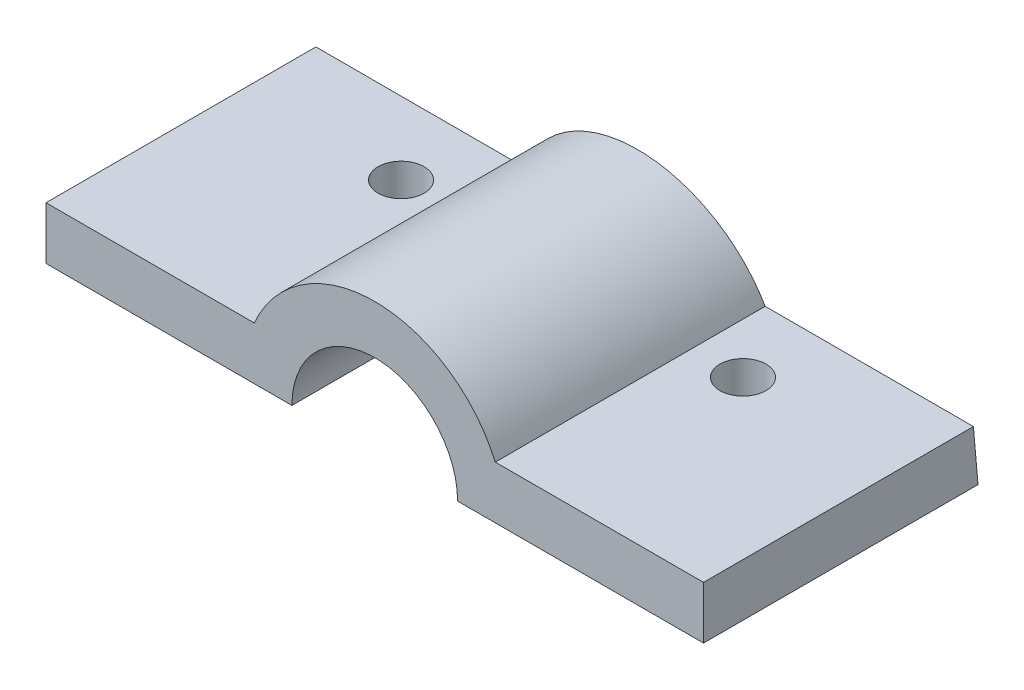
ISO-10303-21;
HEADER;
FILE_DESCRIPTION(('STEP AP214'),'2;1');
FILE_NAME('part.step','',(''),(''),'','','');
FILE_SCHEMA(('AUTOMOTIVE_DESIGN { 1 0 10303 214 1 1 1 1 }'));
ENDSEC;
DATA;
#1=APPLICATION_CONTEXT('core data for automotive mechanical design processes');
#2=APPLICATION_PROTOCOL_DEFINITION('international standard','automotive_design',2000,#1);
#3=PRODUCT_CONTEXT('',#1,'mechanical');
#4=PRODUCT('Part','Part','',(#3));
#5=PRODUCT_RELATED_PRODUCT_CATEGORY('part','',(#4));
#6=PRODUCT_DEFINITION_FORMATION('','',#4);
#7=PRODUCT_DEFINITION_CONTEXT('part definition',#1,'design');
#8=PRODUCT_DEFINITION('design','',#6,#7);
#9=PRODUCT_DEFINITION_SHAPE('','',#8);
#10=(LENGTH_UNIT() NAMED_UNIT(*) SI_UNIT(.MILLI.,.METRE.));
#11=(NAMED_UNIT(*) PLANE_ANGLE_UNIT() SI_UNIT($,.RADIAN.));
#12=(NAMED_UNIT(*) SI_UNIT($,.STERADIAN.) SOLID_ANGLE_UNIT());
#13=UNCERTAINTY_MEASURE_WITH_UNIT(LENGTH_MEASURE(1.E-05),#10,'distance_accuracy_value','');
#14=(GEOMETRIC_REPRESENTATION_CONTEXT(3) GLOBAL_UNCERTAINTY_ASSIGNED_CONTEXT((#13)) GLOBAL_UNIT_ASSIGNED_CONTEXT((#10,
#11,#12)) REPRESENTATION_CONTEXT('',''));
#15=CARTESIAN_POINT('',(0.,0.,0.));
#16=DIRECTION('',(0.,0.,1.));
#17=DIRECTION('',(1.,0.,0.));
#18=AXIS2_PLACEMENT_3D('',#15,#16,#17);
#19=CARTESIAN_POINT('',(31.9445192885683,0.,26.50744));
#20=DIRECTION('',(-1.,0.,0.));
#21=DIRECTION('',(0.,0.,1.));
#22=AXIS2_PLACEMENT_3D('',#19,#20,#21);
#23=PLANE('',#22);
#24=DIRECTION('',(0.,0.996194698091746,0.0871557427476584));
#25=VECTOR('',#24,1.);
#26=CARTESIAN_POINT('',(31.9445192885683,10.4311217758785,0.938132252128049));
#27=LINE('',#26,#25);
#28=CARTESIAN_POINT('',(31.9445192885683,-0.291778932852456,0.));
#29=VERTEX_POINT('',#28);
#30=CARTESIAN_POINT('',(31.9445192885683,4.78822106714754,0.44444241071169));
#31=VERTEX_POINT('',#30);
#32=EDGE_CURVE('E112',#29,#31,#27,.T.);
#33=ORIENTED_EDGE('',*,*,#32,.T.);
#34=DIRECTION('',(0.,0.,-1.));
#35=VECTOR('',#34,1.);
#36=CARTESIAN_POINT('',(31.9445192885683,4.78822106714754,26.50744));
#37=LINE('',#36,#35);
#38=CARTESIAN_POINT('',(31.9445192885683,4.78822106714754,26.50744));
#39=VERTEX_POINT('',#38);
#40=EDGE_CURVE('E54',#39,#31,#37,.T.);
#41=ORIENTED_EDGE('',*,*,#40,.F.);
#42=DIRECTION('',(0.,1.,0.));
#43=VECTOR('',#42,1.);
#44=CARTESIAN_POINT('',(31.9445192885683,0.,26.50744));
#45=LINE('',#44,#43);
#46=CARTESIAN_POINT('',(31.9445192885683,-0.291778932852456,26.50744));
#47=VERTEX_POINT('',#46);
#48=EDGE_CURVE('E165',#47,#39,#45,.T.);
#49=ORIENTED_EDGE('',*,*,#48,.F.);
#50=DIRECTION('',(0.,0.,-1.));
#51=VECTOR('',#50,1.);
#52=CARTESIAN_POINT('',(31.9445192885683,-0.291778932852456,26.50744));
#53=LINE('',#52,#51);
#54=EDGE_CURVE('E11',#47,#29,#53,.T.);
#55=ORIENTED_EDGE('',*,*,#54,.T.);
#56=EDGE_LOOP('',(#33,#41,#49,#55));
#57=FACE_BOUND('',#56,.T.);
#58=ADVANCED_FACE('F44',(#57),#23,.F.);
#59=CARTESIAN_POINT('',(0.,4.78822106714754,26.50744));
#60=DIRECTION('',(0.,-1.,0.));
#61=DIRECTION('',(0.,0.,-1.));
#62=AXIS2_PLACEMENT_3D('',#59,#60,#61);
#63=PLANE('',#62);
#64=CARTESIAN_POINT('',(16.7045192885682,4.78822106714754,7.4574399999999));
#65=DIRECTION('',(0.,-1.,0.));
#66=DIRECTION('',(0.,0.,-1.));
#67=AXIS2_PLACEMENT_3D('',#64,#65,#66);
#68=CIRCLE('',#67,2.2225);
#69=CARTESIAN_POINT('',(16.7045192885682,4.78822106714754,5.2349399999999));
#70=VERTEX_POINT('',#69);
#71=EDGE_CURVE('E237',#70,#70,#68,.T.);
#72=ORIENTED_EDGE('',*,*,#71,.T.);
#73=EDGE_LOOP('',(#72));
#74=FACE_BOUND('',#73,.T.);
#75=DIRECTION('',(-1.,0.,0.));
#76=VECTOR('',#75,1.);
#77=CARTESIAN_POINT('',(11.8342615537561,4.78822106714755,0.44444241071169));
#78=LINE('',#77,#76);
#79=CARTESIAN_POINT('',(11.8342615537561,4.78822106714755,0.44444241071169));
#80=VERTEX_POINT('',#79);
#81=EDGE_CURVE('E161',#31,#80,#78,.T.);
#82=ORIENTED_EDGE('',*,*,#81,.T.);
#83=DIRECTION('',(0.,0.,-1.));
#84=VECTOR('',#83,1.);
#85=CARTESIAN_POINT('',(11.8342615537561,4.78822106714754,26.50744));
#86=LINE('',#85,#84);
#87=CARTESIAN_POINT('',(11.8342615537561,4.78822106714754,26.50744));
#88=VERTEX_POINT('',#87);
#89=EDGE_CURVE('E150',#88,#80,#86,.T.);
#90=ORIENTED_EDGE('',*,*,#89,.F.);
#91=DIRECTION('',(-1.,0.,0.));
#92=VECTOR('',#91,1.);
#93=CARTESIAN_POINT('',(0.,4.78822106714754,26.50744));
#94=LINE('',#93,#92);
#95=EDGE_CURVE('E162',#39,#88,#94,.T.);
#96=ORIENTED_EDGE('',*,*,#95,.F.);
#97=ORIENTED_EDGE('',*,*,#40,.T.);
#98=EDGE_LOOP('',(#82,#90,#96,#97));
#99=FACE_BOUND('',#98,.T.);
#100=ADVANCED_FACE('F159',(#74,#99),#63,.F.);
#101=CARTESIAN_POINT('',(0.194519288568312,-0.291778932852454,26.50744));
#102=DIRECTION('',(0.,0.,-1.));
#103=DIRECTION('',(-1.,0.,0.));
#104=AXIS2_PLACEMENT_3D('',#101,#102,#103);
#105=CYLINDRICAL_SURFACE('',#104,12.7);
#106=CARTESIAN_POINT('',(0.194519288568312,-0.291778932852454,0.));
#107=DIRECTION('',(0.,0.0871557427476584,-0.996194698091746));
#108=DIRECTION('',(0.,-0.996194698091746,-0.0871557427476584));
#109=AXIS2_PLACEMENT_3D('',#106,#107,#108);
#110=ELLIPSE('',#109,12.7485119368005,12.7);
#111=CARTESIAN_POINT('',(-11.4452229766195,4.78822106714754,0.44444241071169));
#112=VERTEX_POINT('',#111);
#113=EDGE_CURVE('E169',#80,#112,#110,.F.);
#114=ORIENTED_EDGE('',*,*,#113,.T.);
#115=DIRECTION('',(0.,0.,-1.));
#116=VECTOR('',#115,1.);
#117=CARTESIAN_POINT('',(-11.4452229766195,4.78822106714754,26.50744));
#118=LINE('',#117,#116);
#119=CARTESIAN_POINT('',(-11.4452229766195,4.78822106714754,26.50744));
#120=VERTEX_POINT('',#119);
#121=EDGE_CURVE('E146',#120,#112,#118,.T.);
#122=ORIENTED_EDGE('',*,*,#121,.F.);
#123=CARTESIAN_POINT('',(0.194519288568312,-0.291778932852454,26.50744));
#124=DIRECTION('',(0.,0.,1.));
#125=DIRECTION('',(1.,0.,0.));
#126=AXIS2_PLACEMENT_3D('',#123,#124,#125);
#127=CIRCLE('',#126,12.7);
#128=EDGE_CURVE('E179',#88,#120,#127,.T.);
#129=ORIENTED_EDGE('',*,*,#128,.F.);
#130=ORIENTED_EDGE('',*,*,#89,.T.);
#131=EDGE_LOOP('',(#114,#122,#129,#130));
#132=FACE_BOUND('',#131,.T.);
#133=ADVANCED_FACE('F213',(#132),#105,.T.);
#134=CARTESIAN_POINT('',(0.,4.78822106714754,26.50744));
#135=DIRECTION('',(0.,1.,0.));
#136=DIRECTION('',(0.,0.,1.));
#137=AXIS2_PLACEMENT_3D('',#134,#135,#136);
#138=PLANE('',#137);
#139=CARTESIAN_POINT('',(-16.3154807114317,4.78822106714754,7.45744));
#140=DIRECTION('',(0.,1.,0.));
#141=DIRECTION('',(0.,0.,1.));
#142=AXIS2_PLACEMENT_3D('',#139,#140,#141);
#143=CIRCLE('',#142,2.2225);
#144=CARTESIAN_POINT('',(-16.3154807114317,4.78822106714754,9.67994));
#145=VERTEX_POINT('',#144);
#146=EDGE_CURVE('E240',#145,#145,#143,.F.);
#147=ORIENTED_EDGE('',*,*,#146,.T.);
#148=EDGE_LOOP('',(#147));
#149=FACE_BOUND('',#148,.T.);
#150=ORIENTED_EDGE('',*,*,#121,.T.);
#151=DIRECTION('',(-1.,0.,0.));
#152=VECTOR('',#151,1.);
#153=CARTESIAN_POINT('',(-31.5554807114317,4.78822106714754,0.44444241071169));
#154=LINE('',#153,#152);
#155=CARTESIAN_POINT('',(-31.5554807114317,4.78822106714754,0.444442410711688));
#156=VERTEX_POINT('',#155);
#157=EDGE_CURVE('E204',#112,#156,#154,.T.);
#158=ORIENTED_EDGE('',*,*,#157,.T.);
#159=DIRECTION('',(0.,0.,-1.));
#160=VECTOR('',#159,1.);
#161=CARTESIAN_POINT('',(-31.5554807114317,4.78822106714754,26.50744));
#162=LINE('',#161,#160);
#163=CARTESIAN_POINT('',(-31.5554807114317,4.78822106714754,26.50744));
#164=VERTEX_POINT('',#163);
#165=EDGE_CURVE('E142',#164,#156,#162,.T.);
#166=ORIENTED_EDGE('',*,*,#165,.F.);
#167=DIRECTION('',(1.,0.,0.));
#168=VECTOR('',#167,1.);
#169=CARTESIAN_POINT('',(0.,4.78822106714754,26.50744));
#170=LINE('',#169,#168);
#171=EDGE_CURVE('E182',#164,#120,#170,.T.);
#172=ORIENTED_EDGE('',*,*,#171,.T.);
#173=EDGE_LOOP('',(#150,#158,#166,#172));
#174=FACE_BOUND('',#173,.T.);
#175=ADVANCED_FACE('F216',(#149,#174),#138,.T.);
#176=CARTESIAN_POINT('',(-31.5554807114317,0.,26.50744));
#177=DIRECTION('',(-1.,0.,0.));
#178=DIRECTION('',(0.,0.,1.));
#179=AXIS2_PLACEMENT_3D('',#176,#177,#178);
#180=PLANE('',#179);
#181=ORIENTED_EDGE('',*,*,#165,.T.);
#182=DIRECTION('',(0.,-0.996194698091746,-0.0871557427476584));
#183=VECTOR('',#182,1.);
#184=CARTESIAN_POINT('',(-31.5554807114317,5.38971008322751,0.497065880854047));
#185=LINE('',#184,#183);
#186=CARTESIAN_POINT('',(-31.5554807114317,-0.291778932852456,0.));
#187=VERTEX_POINT('',#186);
#188=EDGE_CURVE('E122',#156,#187,#185,.T.);
#189=ORIENTED_EDGE('',*,*,#188,.T.);
#190=DIRECTION('',(0.,0.,-1.));
#191=VECTOR('',#190,1.);
#192=CARTESIAN_POINT('',(-31.5554807114317,-0.291778932852456,26.50744));
#193=LINE('',#192,#191);
#194=CARTESIAN_POINT('',(-31.5554807114317,-0.291778932852456,26.50744));
#195=VERTEX_POINT('',#194);
#196=EDGE_CURVE('E133',#195,#187,#193,.T.);
#197=ORIENTED_EDGE('',*,*,#196,.F.);
#198=DIRECTION('',(0.,1.,0.));
#199=VECTOR('',#198,1.);
#200=CARTESIAN_POINT('',(-31.5554807114317,0.,26.50744));
#201=LINE('',#200,#199);
#202=EDGE_CURVE('E186',#195,#164,#201,.T.);
#203=ORIENTED_EDGE('',*,*,#202,.T.);
#204=EDGE_LOOP('',(#181,#189,#197,#203));
#205=FACE_BOUND('',#204,.T.);
#206=ADVANCED_FACE('F202',(#205),#180,.T.);
#207=CARTESIAN_POINT('',(0.194519288568312,-0.291778932852454,26.50744));
#208=DIRECTION('',(0.,0.,-1.));
#209=DIRECTION('',(-1.,0.,0.));
#210=AXIS2_PLACEMENT_3D('',#207,#208,#209);
#211=CYLINDRICAL_SURFACE('',#210,8.);
#212=DIRECTION('',(0.,0.,-1.));
#213=VECTOR('',#212,1.);
#214=CARTESIAN_POINT('',(-7.80548071143169,-0.291778932852454,26.50744));
#215=LINE('',#214,#213);
#216=CARTESIAN_POINT('',(-7.80548071143169,-0.291778932852454,26.50744));
#217=VERTEX_POINT('',#216);
#218=CARTESIAN_POINT('',(-7.80548071143169,-0.291778932852454,0.));
#219=VERTEX_POINT('',#218);
#220=EDGE_CURVE('E119',#217,#219,#215,.T.);
#221=ORIENTED_EDGE('',*,*,#220,.T.);
#222=CARTESIAN_POINT('',(0.194519288568312,-0.291778932852454,0.));
#223=DIRECTION('',(0.,0.0871557427476584,-0.996194698091746));
#224=DIRECTION('',(0.,-0.996194698091746,-0.0871557427476584));
#225=AXIS2_PLACEMENT_3D('',#222,#223,#224);
#226=ELLIPSE('',#225,8.03055870034678,8.);
#227=CARTESIAN_POINT('',(8.19451928856831,-0.291778932852454,0.));
#228=VERTEX_POINT('',#227);
#229=EDGE_CURVE('E109',#219,#228,#226,.T.);
#230=ORIENTED_EDGE('',*,*,#229,.T.);
#231=DIRECTION('',(0.,0.,-1.));
#232=VECTOR('',#231,1.);
#233=CARTESIAN_POINT('',(8.19451928856831,-0.291778932852454,26.50744));
#234=LINE('',#233,#232);
#235=CARTESIAN_POINT('',(8.19451928856831,-0.291778932852454,26.50744));
#236=VERTEX_POINT('',#235);
#237=EDGE_CURVE('E61',#236,#228,#234,.T.);
#238=ORIENTED_EDGE('',*,*,#237,.F.);
#239=CARTESIAN_POINT('',(0.194519288568312,-0.291778932852454,26.50744));
#240=DIRECTION('',(0.,0.,1.));
#241=DIRECTION('',(1.,0.,0.));
#242=AXIS2_PLACEMENT_3D('',#239,#240,#241);
#243=CIRCLE('',#242,8.);
#244=EDGE_CURVE('E129',#236,#217,#243,.T.);
#245=ORIENTED_EDGE('',*,*,#244,.T.);
#246=EDGE_LOOP('',(#221,#230,#238,#245));
#247=FACE_BOUND('',#246,.T.);
#248=ADVANCED_FACE('F117',(#247),#211,.F.);
#249=CARTESIAN_POINT('',(0.,-0.291778932852454,26.50744));
#250=DIRECTION('',(0.,-1.,0.));
#251=DIRECTION('',(0.,0.,-1.));
#252=AXIS2_PLACEMENT_3D('',#249,#250,#251);
#253=PLANE('',#252);
#254=CARTESIAN_POINT('',(16.7045192885682,-0.291778932852454,7.4574399999999));
#255=DIRECTION('',(0.,1.,0.));
#256=DIRECTION('',(0.,0.,1.));
#257=AXIS2_PLACEMENT_3D('',#254,#255,#256);
#258=CIRCLE('',#257,2.2225);
#259=CARTESIAN_POINT('',(16.7045192885682,-0.291778932852454,9.67993999999989));
#260=VERTEX_POINT('',#259);
#261=EDGE_CURVE('E241',#260,#260,#258,.T.);
#262=ORIENTED_EDGE('',*,*,#261,.T.);
#263=EDGE_LOOP('',(#262));
#264=FACE_BOUND('',#263,.T.);
#265=DIRECTION('',(-1.,0.,0.));
#266=VECTOR('',#265,1.);
#267=CARTESIAN_POINT('',(0.,-0.291778932852454,0.));
#268=LINE('',#267,#266);
#269=EDGE_CURVE('E107',#29,#228,#268,.T.);
#270=ORIENTED_EDGE('',*,*,#269,.F.);
#271=ORIENTED_EDGE('',*,*,#54,.F.);
#272=DIRECTION('',(-1.,0.,0.));
#273=VECTOR('',#272,1.);
#274=CARTESIAN_POINT('',(0.,-0.291778932852454,26.50744));
#275=LINE('',#274,#273);
#276=EDGE_CURVE('E126',#47,#236,#275,.T.);
#277=ORIENTED_EDGE('',*,*,#276,.T.);
#278=ORIENTED_EDGE('',*,*,#237,.T.);
#279=EDGE_LOOP('',(#270,#271,#277,#278));
#280=FACE_BOUND('',#279,.T.);
#281=ADVANCED_FACE('F46',(#264,#280),#253,.T.);
#282=CARTESIAN_POINT('',(0.,-0.291778932852454,26.50744));
#283=DIRECTION('',(0.,1.,0.));
#284=DIRECTION('',(0.,0.,1.));
#285=AXIS2_PLACEMENT_3D('',#282,#283,#284);
#286=PLANE('',#285);
#287=CARTESIAN_POINT('',(-16.3154807114317,-0.291778932852454,7.45744));
#288=DIRECTION('',(0.,-1.,0.));
#289=DIRECTION('',(0.,0.,-1.));
#290=AXIS2_PLACEMENT_3D('',#287,#288,#289);
#291=CIRCLE('',#290,2.2225);
#292=CARTESIAN_POINT('',(-16.3154807114317,-0.291778932852454,5.23494));
#293=VERTEX_POINT('',#292);
#294=EDGE_CURVE('E123',#293,#293,#291,.T.);
#295=ORIENTED_EDGE('',*,*,#294,.F.);
#296=EDGE_LOOP('',(#295));
#297=FACE_BOUND('',#296,.T.);
#298=DIRECTION('',(1.,0.,0.));
#299=VECTOR('',#298,1.);
#300=CARTESIAN_POINT('',(0.,-0.291778932852454,0.));
#301=LINE('',#300,#299);
#302=EDGE_CURVE('E115',#187,#219,#301,.T.);
#303=ORIENTED_EDGE('',*,*,#302,.T.);
#304=ORIENTED_EDGE('',*,*,#220,.F.);
#305=DIRECTION('',(1.,0.,0.));
#306=VECTOR('',#305,1.);
#307=CARTESIAN_POINT('',(0.,-0.291778932852454,26.50744));
#308=LINE('',#307,#306);
#309=EDGE_CURVE('E135',#195,#217,#308,.T.);
#310=ORIENTED_EDGE('',*,*,#309,.F.);
#311=ORIENTED_EDGE('',*,*,#196,.T.);
#312=EDGE_LOOP('',(#303,#304,#310,#311));
#313=FACE_BOUND('',#312,.T.);
#314=ADVANCED_FACE('F197',(#297,#313),#286,.F.);
#315=CARTESIAN_POINT('',(0.,0.,26.50744));
#316=DIRECTION('',(0.,0.,1.));
#317=DIRECTION('',(1.,0.,0.));
#318=AXIS2_PLACEMENT_3D('',#315,#316,#317);
#319=PLANE('',#318);
#320=ORIENTED_EDGE('',*,*,#276,.F.);
#321=ORIENTED_EDGE('',*,*,#48,.T.);
#322=ORIENTED_EDGE('',*,*,#95,.T.);
#323=ORIENTED_EDGE('',*,*,#128,.T.);
#324=ORIENTED_EDGE('',*,*,#171,.F.);
#325=ORIENTED_EDGE('',*,*,#202,.F.);
#326=ORIENTED_EDGE('',*,*,#309,.T.);
#327=ORIENTED_EDGE('',*,*,#244,.F.);
#328=EDGE_LOOP('',(#320,#321,#322,#323,#324,#325,#326,#327));
#329=FACE_BOUND('',#328,.T.);
#330=ADVANCED_FACE('F194',(#329),#319,.T.);
#331=CARTESIAN_POINT('',(0.,-0.00221638880686443,0.0253334399857152));
#332=DIRECTION('',(0.,0.0871557427476584,-0.996194698091746));
#333=DIRECTION('',(0.,0.996194698091746,0.0871557427476584));
#334=AXIS2_PLACEMENT_3D('',#331,#332,#333);
#335=PLANE('',#334);
#336=ORIENTED_EDGE('',*,*,#32,.F.);
#337=ORIENTED_EDGE('',*,*,#269,.T.);
#338=ORIENTED_EDGE('',*,*,#229,.F.);
#339=ORIENTED_EDGE('',*,*,#302,.F.);
#340=ORIENTED_EDGE('',*,*,#188,.F.);
#341=ORIENTED_EDGE('',*,*,#157,.F.);
#342=ORIENTED_EDGE('',*,*,#113,.F.);
#343=ORIENTED_EDGE('',*,*,#81,.F.);
#344=EDGE_LOOP('',(#336,#337,#338,#339,#340,#341,#342,#343));
#345=FACE_BOUND('',#344,.T.);
#346=ADVANCED_FACE('F108',(#345),#335,.T.);
#347=CARTESIAN_POINT('',(-16.3154807114317,12.4092210671475,7.45744));
#348=DIRECTION('',(0.,-1.,0.));
#349=DIRECTION('',(0.,0.,-1.));
#350=AXIS2_PLACEMENT_3D('',#347,#348,#349);
#351=CYLINDRICAL_SURFACE('',#350,2.2225);
#352=ORIENTED_EDGE('',*,*,#146,.F.);
#353=EDGE_LOOP('',(#352));
#354=FACE_BOUND('',#353,.T.);
#355=ORIENTED_EDGE('',*,*,#294,.T.);
#356=EDGE_LOOP('',(#355));
#357=FACE_BOUND('',#356,.T.);
#358=ADVANCED_FACE('F252',(#354,#357),#351,.F.);
#359=CARTESIAN_POINT('',(16.7045192885682,12.4092210671475,7.4574399999999));
#360=DIRECTION('',(0.,-1.,0.));
#361=DIRECTION('',(0.,0.,-1.));
#362=AXIS2_PLACEMENT_3D('',#359,#360,#361);
#363=CYLINDRICAL_SURFACE('',#362,2.2225);
#364=ORIENTED_EDGE('',*,*,#261,.F.);
#365=EDGE_LOOP('',(#364));
#366=FACE_BOUND('',#365,.T.);
#367=ORIENTED_EDGE('',*,*,#71,.F.);
#368=EDGE_LOOP('',(#367));
#369=FACE_BOUND('',#368,.T.);
#370=ADVANCED_FACE('F267',(#366,#369),#363,.F.);
#371=CLOSED_SHELL('',(#58,#100,#133,#175,#206,#248,#281,#314,#330,#346,#358,#370));
#372=MANIFOLD_SOLID_BREP('B2',#371);
#373=ADVANCED_BREP_SHAPE_REPRESENTATION('',(#18,#372),#14);
#374=SHAPE_DEFINITION_REPRESENTATION(#9,#373);
ENDSEC;
END-ISO-10303-21;
